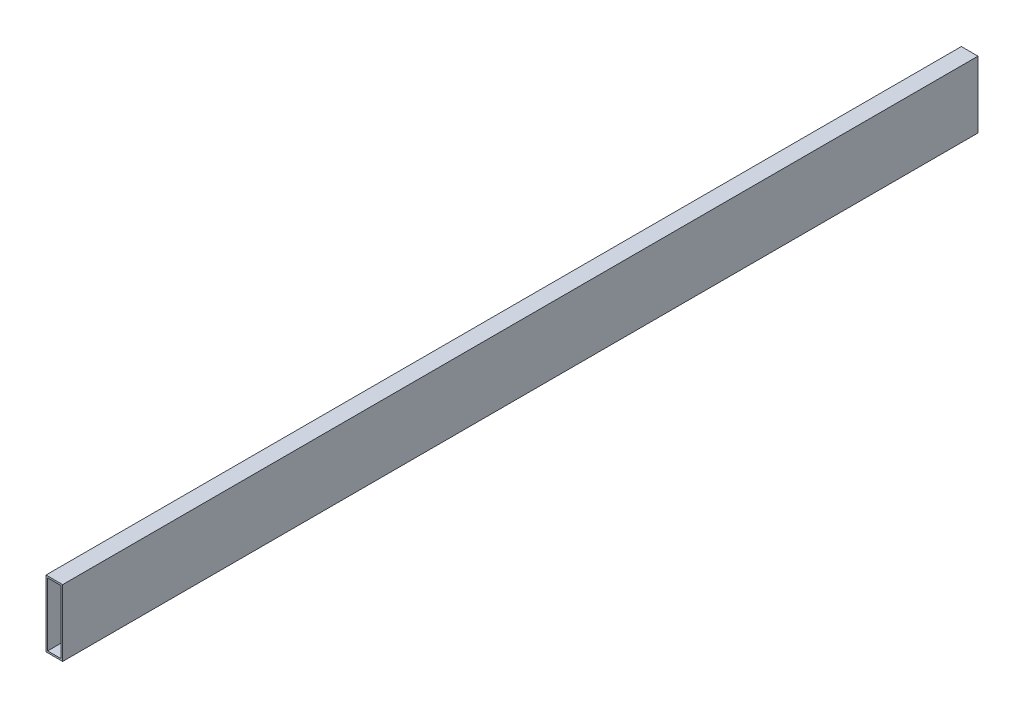
ISO-10303-21;
HEADER;
FILE_DESCRIPTION(('STEP AP214'),'2;1');
FILE_NAME('part.step','',(''),(''),'','','');
FILE_SCHEMA(('AUTOMOTIVE_DESIGN { 1 0 10303 214 1 1 1 1 }'));
ENDSEC;
DATA;
#1=APPLICATION_CONTEXT('core data for automotive mechanical design processes');
#2=APPLICATION_PROTOCOL_DEFINITION('international standard','automotive_design',2000,#1);
#3=PRODUCT_CONTEXT('',#1,'mechanical');
#4=PRODUCT('Part','Part','',(#3));
#5=PRODUCT_RELATED_PRODUCT_CATEGORY('part','',(#4));
#6=PRODUCT_DEFINITION_FORMATION('','',#4);
#7=PRODUCT_DEFINITION_CONTEXT('part definition',#1,'design');
#8=PRODUCT_DEFINITION('design','',#6,#7);
#9=PRODUCT_DEFINITION_SHAPE('','',#8);
#10=(LENGTH_UNIT() NAMED_UNIT(*) SI_UNIT(.MILLI.,.METRE.));
#11=(NAMED_UNIT(*) PLANE_ANGLE_UNIT() SI_UNIT($,.RADIAN.));
#12=(NAMED_UNIT(*) SI_UNIT($,.STERADIAN.) SOLID_ANGLE_UNIT());
#13=UNCERTAINTY_MEASURE_WITH_UNIT(LENGTH_MEASURE(1.E-05),#10,'distance_accuracy_value','');
#14=(GEOMETRIC_REPRESENTATION_CONTEXT(3) GLOBAL_UNCERTAINTY_ASSIGNED_CONTEXT((#13)) GLOBAL_UNIT_ASSIGNED_CONTEXT((#10,
#11,#12)) REPRESENTATION_CONTEXT('',''));
#15=CARTESIAN_POINT('',(0.,0.,0.));
#16=DIRECTION('',(0.,0.,1.));
#17=DIRECTION('',(1.,0.,0.));
#18=AXIS2_PLACEMENT_3D('',#15,#16,#17);
#19=CARTESIAN_POINT('',(0.,0.,550.));
#20=DIRECTION('',(0.,0.,1.));
#21=DIRECTION('',(1.,0.,0.));
#22=AXIS2_PLACEMENT_3D('',#19,#20,#21);
#23=PLANE('',#22);
#24=DIRECTION('',(0.,1.,0.));
#25=VECTOR('',#24,1.);
#26=CARTESIAN_POINT('',(5.,20.,550.));
#27=LINE('',#26,#25);
#28=CARTESIAN_POINT('',(5.,-20.,550.));
#29=VERTEX_POINT('',#28);
#30=CARTESIAN_POINT('',(5.,20.,550.));
#31=VERTEX_POINT('',#30);
#32=EDGE_CURVE('E136',#29,#31,#27,.T.);
#33=ORIENTED_EDGE('',*,*,#32,.T.);
#34=DIRECTION('',(-1.,0.,0.));
#35=VECTOR('',#34,1.);
#36=CARTESIAN_POINT('',(-5.,20.,550.));
#37=LINE('',#36,#35);
#38=CARTESIAN_POINT('',(-5.,20.,550.));
#39=VERTEX_POINT('',#38);
#40=EDGE_CURVE('E139',#31,#39,#37,.T.);
#41=ORIENTED_EDGE('',*,*,#40,.T.);
#42=DIRECTION('',(0.,-1.,0.));
#43=VECTOR('',#42,1.);
#44=CARTESIAN_POINT('',(-5.,20.,550.));
#45=LINE('',#44,#43);
#46=CARTESIAN_POINT('',(-5.,-20.,550.));
#47=VERTEX_POINT('',#46);
#48=EDGE_CURVE('E142',#39,#47,#45,.T.);
#49=ORIENTED_EDGE('',*,*,#48,.T.);
#50=DIRECTION('',(1.,0.,0.));
#51=VECTOR('',#50,1.);
#52=CARTESIAN_POINT('',(-5.,-20.,550.));
#53=LINE('',#52,#51);
#54=EDGE_CURVE('E144',#47,#29,#53,.T.);
#55=ORIENTED_EDGE('',*,*,#54,.T.);
#56=EDGE_LOOP('',(#33,#41,#49,#55));
#57=FACE_BOUND('',#56,.T.);
#58=DIRECTION('',(-1.,0.,0.));
#59=VECTOR('',#58,1.);
#60=CARTESIAN_POINT('',(-4.,19.,550.));
#61=LINE('',#60,#59);
#62=CARTESIAN_POINT('',(4.,19.,550.));
#63=VERTEX_POINT('',#62);
#64=CARTESIAN_POINT('',(-4.,19.,550.));
#65=VERTEX_POINT('',#64);
#66=EDGE_CURVE('E108',#63,#65,#61,.T.);
#67=ORIENTED_EDGE('',*,*,#66,.F.);
#68=DIRECTION('',(0.,1.,0.));
#69=VECTOR('',#68,1.);
#70=CARTESIAN_POINT('',(4.,19.,550.));
#71=LINE('',#70,#69);
#72=CARTESIAN_POINT('',(4.00000000000001,-19.,550.));
#73=VERTEX_POINT('',#72);
#74=EDGE_CURVE('E100',#73,#63,#71,.T.);
#75=ORIENTED_EDGE('',*,*,#74,.F.);
#76=DIRECTION('',(1.,0.,0.));
#77=VECTOR('',#76,1.);
#78=CARTESIAN_POINT('',(-3.99999999999999,-19.,550.));
#79=LINE('',#78,#77);
#80=CARTESIAN_POINT('',(-3.99999999999999,-19.,550.));
#81=VERTEX_POINT('',#80);
#82=EDGE_CURVE('E122',#81,#73,#79,.T.);
#83=ORIENTED_EDGE('',*,*,#82,.F.);
#84=DIRECTION('',(0.,-1.,0.));
#85=VECTOR('',#84,1.);
#86=CARTESIAN_POINT('',(-4.,19.,550.));
#87=LINE('',#86,#85);
#88=EDGE_CURVE('E120',#65,#81,#87,.T.);
#89=ORIENTED_EDGE('',*,*,#88,.F.);
#90=EDGE_LOOP('',(#67,#75,#83,#89));
#91=FACE_BOUND('',#90,.T.);
#92=ADVANCED_FACE('F35',(#57,#91),#23,.T.);
#93=CARTESIAN_POINT('',(0.,0.,0.));
#94=DIRECTION('',(0.,0.,1.));
#95=DIRECTION('',(1.,0.,0.));
#96=AXIS2_PLACEMENT_3D('',#93,#94,#95);
#97=PLANE('',#96);
#98=DIRECTION('',(0.,1.,0.));
#99=VECTOR('',#98,1.);
#100=CARTESIAN_POINT('',(5.,20.,0.));
#101=LINE('',#100,#99);
#102=CARTESIAN_POINT('',(5.,-20.,0.));
#103=VERTEX_POINT('',#102);
#104=CARTESIAN_POINT('',(5.,20.,0.));
#105=VERTEX_POINT('',#104);
#106=EDGE_CURVE('E116',#103,#105,#101,.T.);
#107=ORIENTED_EDGE('',*,*,#106,.F.);
#108=DIRECTION('',(1.,0.,0.));
#109=VECTOR('',#108,1.);
#110=CARTESIAN_POINT('',(-5.,-20.,0.));
#111=LINE('',#110,#109);
#112=CARTESIAN_POINT('',(-5.,-20.,0.));
#113=VERTEX_POINT('',#112);
#114=EDGE_CURVE('E140',#113,#103,#111,.T.);
#115=ORIENTED_EDGE('',*,*,#114,.F.);
#116=DIRECTION('',(0.,-1.,0.));
#117=VECTOR('',#116,1.);
#118=CARTESIAN_POINT('',(-5.,20.,0.));
#119=LINE('',#118,#117);
#120=CARTESIAN_POINT('',(-5.,20.,0.));
#121=VERTEX_POINT('',#120);
#122=EDGE_CURVE('E151',#121,#113,#119,.T.);
#123=ORIENTED_EDGE('',*,*,#122,.F.);
#124=DIRECTION('',(-1.,0.,0.));
#125=VECTOR('',#124,1.);
#126=CARTESIAN_POINT('',(-5.,20.,0.));
#127=LINE('',#126,#125);
#128=EDGE_CURVE('E149',#105,#121,#127,.T.);
#129=ORIENTED_EDGE('',*,*,#128,.F.);
#130=EDGE_LOOP('',(#107,#115,#123,#129));
#131=FACE_BOUND('',#130,.T.);
#132=DIRECTION('',(0.,1.,0.));
#133=VECTOR('',#132,1.);
#134=CARTESIAN_POINT('',(4.,19.,0.));
#135=LINE('',#134,#133);
#136=CARTESIAN_POINT('',(4.00000000000001,-19.,0.));
#137=VERTEX_POINT('',#136);
#138=CARTESIAN_POINT('',(4.,19.,0.));
#139=VERTEX_POINT('',#138);
#140=EDGE_CURVE('E58',#137,#139,#135,.T.);
#141=ORIENTED_EDGE('',*,*,#140,.T.);
#142=DIRECTION('',(-1.,0.,0.));
#143=VECTOR('',#142,1.);
#144=CARTESIAN_POINT('',(-4.,19.,0.));
#145=LINE('',#144,#143);
#146=CARTESIAN_POINT('',(-4.,19.,0.));
#147=VERTEX_POINT('',#146);
#148=EDGE_CURVE('E115',#139,#147,#145,.T.);
#149=ORIENTED_EDGE('',*,*,#148,.T.);
#150=DIRECTION('',(0.,-1.,0.));
#151=VECTOR('',#150,1.);
#152=CARTESIAN_POINT('',(-4.,19.,0.));
#153=LINE('',#152,#151);
#154=CARTESIAN_POINT('',(-3.99999999999999,-19.,0.));
#155=VERTEX_POINT('',#154);
#156=EDGE_CURVE('E128',#147,#155,#153,.T.);
#157=ORIENTED_EDGE('',*,*,#156,.T.);
#158=DIRECTION('',(1.,0.,0.));
#159=VECTOR('',#158,1.);
#160=CARTESIAN_POINT('',(-3.99999999999999,-19.,0.));
#161=LINE('',#160,#159);
#162=EDGE_CURVE('E109',#155,#137,#161,.T.);
#163=ORIENTED_EDGE('',*,*,#162,.T.);
#164=EDGE_LOOP('',(#141,#149,#157,#163));
#165=FACE_BOUND('',#164,.T.);
#166=ADVANCED_FACE('F169',(#131,#165),#97,.F.);
#167=CARTESIAN_POINT('',(5.,20.,550.));
#168=DIRECTION('',(-1.,0.,0.));
#169=DIRECTION('',(0.,0.,1.));
#170=AXIS2_PLACEMENT_3D('',#167,#168,#169);
#171=PLANE('',#170);
#172=ORIENTED_EDGE('',*,*,#106,.T.);
#173=DIRECTION('',(0.,0.,-1.));
#174=VECTOR('',#173,1.);
#175=CARTESIAN_POINT('',(5.,20.,550.));
#176=LINE('',#175,#174);
#177=EDGE_CURVE('E11',#31,#105,#176,.T.);
#178=ORIENTED_EDGE('',*,*,#177,.F.);
#179=ORIENTED_EDGE('',*,*,#32,.F.);
#180=DIRECTION('',(0.,0.,-1.));
#181=VECTOR('',#180,1.);
#182=CARTESIAN_POINT('',(5.,-20.,550.));
#183=LINE('',#182,#181);
#184=EDGE_CURVE('E146',#29,#103,#183,.T.);
#185=ORIENTED_EDGE('',*,*,#184,.T.);
#186=EDGE_LOOP('',(#172,#178,#179,#185));
#187=FACE_BOUND('',#186,.T.);
#188=ADVANCED_FACE('F37',(#187),#171,.F.);
#189=CARTESIAN_POINT('',(-5.,20.,550.));
#190=DIRECTION('',(0.,-1.,0.));
#191=DIRECTION('',(0.,0.,-1.));
#192=AXIS2_PLACEMENT_3D('',#189,#190,#191);
#193=PLANE('',#192);
#194=ORIENTED_EDGE('',*,*,#128,.T.);
#195=DIRECTION('',(0.,0.,-1.));
#196=VECTOR('',#195,1.);
#197=CARTESIAN_POINT('',(-5.,20.,550.));
#198=LINE('',#197,#196);
#199=EDGE_CURVE('E43',#39,#121,#198,.T.);
#200=ORIENTED_EDGE('',*,*,#199,.F.);
#201=ORIENTED_EDGE('',*,*,#40,.F.);
#202=ORIENTED_EDGE('',*,*,#177,.T.);
#203=EDGE_LOOP('',(#194,#200,#201,#202));
#204=FACE_BOUND('',#203,.T.);
#205=ADVANCED_FACE('F179',(#204),#193,.F.);
#206=CARTESIAN_POINT('',(-5.,20.,550.));
#207=DIRECTION('',(1.,0.,0.));
#208=DIRECTION('',(0.,0.,-1.));
#209=AXIS2_PLACEMENT_3D('',#206,#207,#208);
#210=PLANE('',#209);
#211=ORIENTED_EDGE('',*,*,#122,.T.);
#212=DIRECTION('',(0.,0.,-1.));
#213=VECTOR('',#212,1.);
#214=CARTESIAN_POINT('',(-5.,-20.,550.));
#215=LINE('',#214,#213);
#216=EDGE_CURVE('E156',#47,#113,#215,.T.);
#217=ORIENTED_EDGE('',*,*,#216,.F.);
#218=ORIENTED_EDGE('',*,*,#48,.F.);
#219=ORIENTED_EDGE('',*,*,#199,.T.);
#220=EDGE_LOOP('',(#211,#217,#218,#219));
#221=FACE_BOUND('',#220,.T.);
#222=ADVANCED_FACE('F163',(#221),#210,.F.);
#223=CARTESIAN_POINT('',(-5.,-20.,550.));
#224=DIRECTION('',(0.,1.,0.));
#225=DIRECTION('',(0.,0.,1.));
#226=AXIS2_PLACEMENT_3D('',#223,#224,#225);
#227=PLANE('',#226);
#228=ORIENTED_EDGE('',*,*,#114,.T.);
#229=ORIENTED_EDGE('',*,*,#184,.F.);
#230=ORIENTED_EDGE('',*,*,#54,.F.);
#231=ORIENTED_EDGE('',*,*,#216,.T.);
#232=EDGE_LOOP('',(#228,#229,#230,#231));
#233=FACE_BOUND('',#232,.T.);
#234=ADVANCED_FACE('F173',(#233),#227,.F.);
#235=CARTESIAN_POINT('',(4.,19.,550.));
#236=DIRECTION('',(-1.,0.,0.));
#237=DIRECTION('',(0.,-1.,0.));
#238=AXIS2_PLACEMENT_3D('',#235,#236,#237);
#239=PLANE('',#238);
#240=ORIENTED_EDGE('',*,*,#140,.F.);
#241=DIRECTION('',(0.,0.,-1.));
#242=VECTOR('',#241,1.);
#243=CARTESIAN_POINT('',(4.00000000000001,-19.,550.));
#244=LINE('',#243,#242);
#245=EDGE_CURVE('E104',#73,#137,#244,.T.);
#246=ORIENTED_EDGE('',*,*,#245,.F.);
#247=ORIENTED_EDGE('',*,*,#74,.T.);
#248=DIRECTION('',(0.,0.,-1.));
#249=VECTOR('',#248,1.);
#250=CARTESIAN_POINT('',(4.,19.,550.));
#251=LINE('',#250,#249);
#252=EDGE_CURVE('E103',#63,#139,#251,.T.);
#253=ORIENTED_EDGE('',*,*,#252,.T.);
#254=EDGE_LOOP('',(#240,#246,#247,#253));
#255=FACE_BOUND('',#254,.T.);
#256=ADVANCED_FACE('F102',(#255),#239,.T.);
#257=CARTESIAN_POINT('',(-4.,19.,550.));
#258=DIRECTION('',(0.,-1.,0.));
#259=DIRECTION('',(0.,0.,-1.));
#260=AXIS2_PLACEMENT_3D('',#257,#258,#259);
#261=PLANE('',#260);
#262=ORIENTED_EDGE('',*,*,#148,.F.);
#263=ORIENTED_EDGE('',*,*,#252,.F.);
#264=ORIENTED_EDGE('',*,*,#66,.T.);
#265=DIRECTION('',(0.,0.,-1.));
#266=VECTOR('',#265,1.);
#267=CARTESIAN_POINT('',(-4.,19.,550.));
#268=LINE('',#267,#266);
#269=EDGE_CURVE('E117',#65,#147,#268,.T.);
#270=ORIENTED_EDGE('',*,*,#269,.T.);
#271=EDGE_LOOP('',(#262,#263,#264,#270));
#272=FACE_BOUND('',#271,.T.);
#273=ADVANCED_FACE('F112',(#272),#261,.T.);
#274=CARTESIAN_POINT('',(-4.,19.,550.));
#275=DIRECTION('',(1.,0.,0.));
#276=DIRECTION('',(0.,1.,0.));
#277=AXIS2_PLACEMENT_3D('',#274,#275,#276);
#278=PLANE('',#277);
#279=ORIENTED_EDGE('',*,*,#156,.F.);
#280=ORIENTED_EDGE('',*,*,#269,.F.);
#281=ORIENTED_EDGE('',*,*,#88,.T.);
#282=DIRECTION('',(0.,0.,-1.));
#283=VECTOR('',#282,1.);
#284=CARTESIAN_POINT('',(-3.99999999999999,-19.,550.));
#285=LINE('',#284,#283);
#286=EDGE_CURVE('E50',#81,#155,#285,.T.);
#287=ORIENTED_EDGE('',*,*,#286,.T.);
#288=EDGE_LOOP('',(#279,#280,#281,#287));
#289=FACE_BOUND('',#288,.T.);
#290=ADVANCED_FACE('F202',(#289),#278,.T.);
#291=CARTESIAN_POINT('',(-3.99999999999999,-19.,550.));
#292=DIRECTION('',(0.,1.,0.));
#293=DIRECTION('',(0.,0.,1.));
#294=AXIS2_PLACEMENT_3D('',#291,#292,#293);
#295=PLANE('',#294);
#296=ORIENTED_EDGE('',*,*,#162,.F.);
#297=ORIENTED_EDGE('',*,*,#286,.F.);
#298=ORIENTED_EDGE('',*,*,#82,.T.);
#299=ORIENTED_EDGE('',*,*,#245,.T.);
#300=EDGE_LOOP('',(#296,#297,#298,#299));
#301=FACE_BOUND('',#300,.T.);
#302=ADVANCED_FACE('F206',(#301),#295,.T.);
#303=CLOSED_SHELL('',(#92,#166,#188,#205,#222,#234,#256,#273,#290,#302));
#304=MANIFOLD_SOLID_BREP('B2',#303);
#305=ADVANCED_BREP_SHAPE_REPRESENTATION('',(#18,#304),#14);
#306=SHAPE_DEFINITION_REPRESENTATION(#9,#305);
ENDSEC;
END-ISO-10303-21;
